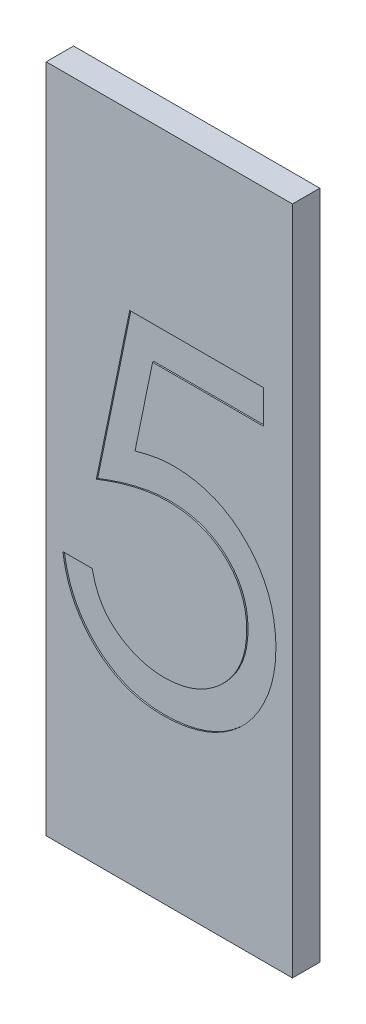
ISO-10303-21;
HEADER;
FILE_DESCRIPTION(('STEP AP214'),'2;1');
FILE_NAME('part.step','',(''),(''),'','','');
FILE_SCHEMA(('AUTOMOTIVE_DESIGN { 1 0 10303 214 1 1 1 1 }'));
ENDSEC;
DATA;
#1=APPLICATION_CONTEXT('core data for automotive mechanical design processes');
#2=APPLICATION_PROTOCOL_DEFINITION('international standard','automotive_design',2000,#1);
#3=PRODUCT_CONTEXT('',#1,'mechanical');
#4=PRODUCT('Part','Part','',(#3));
#5=PRODUCT_RELATED_PRODUCT_CATEGORY('part','',(#4));
#6=PRODUCT_DEFINITION_FORMATION('','',#4);
#7=PRODUCT_DEFINITION_CONTEXT('part definition',#1,'design');
#8=PRODUCT_DEFINITION('design','',#6,#7);
#9=PRODUCT_DEFINITION_SHAPE('','',#8);
#10=(LENGTH_UNIT() NAMED_UNIT(*) SI_UNIT(.MILLI.,.METRE.));
#11=(NAMED_UNIT(*) PLANE_ANGLE_UNIT() SI_UNIT($,.RADIAN.));
#12=(NAMED_UNIT(*) SI_UNIT($,.STERADIAN.) SOLID_ANGLE_UNIT());
#13=UNCERTAINTY_MEASURE_WITH_UNIT(LENGTH_MEASURE(1.E-05),#10,'distance_accuracy_value','');
#14=(GEOMETRIC_REPRESENTATION_CONTEXT(3) GLOBAL_UNCERTAINTY_ASSIGNED_CONTEXT((#13)) GLOBAL_UNIT_ASSIGNED_CONTEXT((#10,
#11,#12)) REPRESENTATION_CONTEXT('',''));
#15=CARTESIAN_POINT('',(0.,0.,0.));
#16=DIRECTION('',(0.,0.,1.));
#17=DIRECTION('',(1.,0.,0.));
#18=AXIS2_PLACEMENT_3D('',#15,#16,#17);
#19=CARTESIAN_POINT('',(0.,0.,2.));
#20=DIRECTION('',(0.,0.,1.));
#21=DIRECTION('',(1.,0.,0.));
#22=AXIS2_PLACEMENT_3D('',#19,#20,#21);
#23=PLANE('',#22);
#24=DIRECTION('',(0.,-1.,0.));
#25=VECTOR('',#24,1.);
#26=CARTESIAN_POINT('',(0.,0.,2.));
#27=LINE('',#26,#25);
#28=CARTESIAN_POINT('',(0.,49.,2.));
#29=VERTEX_POINT('',#28);
#30=CARTESIAN_POINT('',(0.,0.,2.));
#31=VERTEX_POINT('',#30);
#32=EDGE_CURVE('E198',#29,#31,#27,.T.);
#33=ORIENTED_EDGE('',*,*,#32,.T.);
#34=DIRECTION('',(1.,0.,0.));
#35=VECTOR('',#34,1.);
#36=CARTESIAN_POINT('',(18.,0.,2.));
#37=LINE('',#36,#35);
#38=CARTESIAN_POINT('',(18.,0.,2.));
#39=VERTEX_POINT('',#38);
#40=EDGE_CURVE('E85',#31,#39,#37,.T.);
#41=ORIENTED_EDGE('',*,*,#40,.T.);
#42=DIRECTION('',(0.,1.,0.));
#43=VECTOR('',#42,1.);
#44=CARTESIAN_POINT('',(18.,0.,2.));
#45=LINE('',#44,#43);
#46=CARTESIAN_POINT('',(18.,49.,2.));
#47=VERTEX_POINT('',#46);
#48=EDGE_CURVE('E201',#39,#47,#45,.T.);
#49=ORIENTED_EDGE('',*,*,#48,.T.);
#50=DIRECTION('',(-1.,0.,0.));
#51=VECTOR('',#50,1.);
#52=CARTESIAN_POINT('',(18.,49.,2.));
#53=LINE('',#52,#51);
#54=EDGE_CURVE('E57',#47,#29,#53,.T.);
#55=ORIENTED_EDGE('',*,*,#54,.T.);
#56=EDGE_LOOP('',(#33,#41,#49,#55));
#57=FACE_BOUND('',#56,.T.);
#58=DIRECTION('',(0.200944143721331,0.97960270064149,0.));
#59=VECTOR('',#58,1.);
#60=CARTESIAN_POINT('',(3.66346153846154,24.40625,2.));
#61=LINE('',#60,#59);
#62=CARTESIAN_POINT('',(3.66346153846154,24.40625,2.));
#63=VERTEX_POINT('',#62);
#64=CARTESIAN_POINT('',(6.10576923076923,36.3125,2.));
#65=VERTEX_POINT('',#64);
#66=EDGE_CURVE('E183',#63,#65,#61,.T.);
#67=ORIENTED_EDGE('',*,*,#66,.T.);
#68=DIRECTION('',(1.,0.,0.));
#69=VECTOR('',#68,1.);
#70=CARTESIAN_POINT('',(6.10576923076923,36.3125,2.));
#71=LINE('',#70,#69);
#72=CARTESIAN_POINT('',(15.875,36.3125,2.));
#73=VERTEX_POINT('',#72);
#74=EDGE_CURVE('E48',#65,#73,#71,.T.);
#75=ORIENTED_EDGE('',*,*,#74,.T.);
#76=DIRECTION('',(0.,-1.,0.));
#77=VECTOR('',#76,1.);
#78=CARTESIAN_POINT('',(15.875,36.3125,2.));
#79=LINE('',#78,#77);
#80=CARTESIAN_POINT('',(15.875,33.8701923076923,2.));
#81=VERTEX_POINT('',#80);
#82=EDGE_CURVE('E187',#73,#81,#79,.T.);
#83=ORIENTED_EDGE('',*,*,#82,.T.);
#84=DIRECTION('',(-1.,0.,0.));
#85=VECTOR('',#84,1.);
#86=CARTESIAN_POINT('',(15.875,33.8701923076923,2.));
#87=LINE('',#86,#85);
#88=CARTESIAN_POINT('',(7.77531550480769,33.8701923076923,2.));
#89=VERTEX_POINT('',#88);
#90=EDGE_CURVE('E505',#81,#89,#87,.T.);
#91=ORIENTED_EDGE('',*,*,#90,.T.);
#92=DIRECTION('',(-0.200705474463135,-0.979651628141621,0.));
#93=VECTOR('',#92,1.);
#94=CARTESIAN_POINT('',(7.77531550480769,33.8701923076923,2.));
#95=LINE('',#94,#93);
#96=CARTESIAN_POINT('',(6.49214993990385,27.6070087139423,2.));
#97=VERTEX_POINT('',#96);
#98=EDGE_CURVE('E502',#89,#97,#95,.T.);
#99=ORIENTED_EDGE('',*,*,#98,.T.);
#100=CARTESIAN_POINT('',(6.49214993990385,27.6070087139423,2.));
#101=CARTESIAN_POINT('',(6.74426222805327,27.6766110989371,2.));
#102=CARTESIAN_POINT('',(7.23268991219854,27.8114547115334,2.));
#103=CARTESIAN_POINT('',(7.95359539482673,27.9611725424912,2.));
#104=CARTESIAN_POINT('',(8.637981636299,28.051424938668,2.));
#105=CARTESIAN_POINT('',(9.08208728141334,28.063748319117,2.));
#106=CARTESIAN_POINT('',(9.29698768028846,28.0697115384615,2.));
#107=B_SPLINE_CURVE_WITH_KNOTS('',3,(#100,#101,#102,#103,#104,#105,#106),.UNSPECIFIED.,.F.,.F.,
(4,1,1,1,4),(0.,0.275068369018743,0.532901460089936,0.773973459592445,1.),.UNSPECIFIED.);
#108=CARTESIAN_POINT('',(9.29698768028846,28.0697115384615,2.));
#109=VERTEX_POINT('',#108);
#110=EDGE_CURVE('E495',#97,#109,#107,.T.);
#111=ORIENTED_EDGE('',*,*,#110,.T.);
#112=CARTESIAN_POINT('',(9.29698768028846,28.0697115384615,2.));
#113=CARTESIAN_POINT('',(9.56289669511612,28.0639561545391,2.));
#114=CARTESIAN_POINT('',(10.0857402554889,28.052639631768,2.));
#115=CARTESIAN_POINT('',(10.8507266627134,27.9439740132273,2.));
#116=CARTESIAN_POINT('',(11.5809736683581,27.7729328083322,2.));
#117=CARTESIAN_POINT('',(12.2749540797365,27.5339878300879,2.));
#118=CARTESIAN_POINT('',(12.9339517546079,27.2284412524621,2.));
#119=CARTESIAN_POINT('',(13.5519035568236,26.8467613010992,2.));
#120=CARTESIAN_POINT('',(14.1380850719662,26.4009006016703,2.));
#121=CARTESIAN_POINT('',(14.6819802201187,25.8882854310165,2.));
#122=CARTESIAN_POINT('',(15.1754045310298,25.3241222884705,2.));
#123=CARTESIAN_POINT('',(15.6092409964427,24.7175303444068,2.));
#124=CARTESIAN_POINT('',(15.9777400483343,24.0744046430983,2.));
#125=CARTESIAN_POINT('',(16.2741087556185,23.3886005015044,2.));
#126=CARTESIAN_POINT('',(16.5107664584602,22.667699832766,2.));
#127=CARTESIAN_POINT('',(16.668282709094,21.9041174407587,2.));
#128=CARTESIAN_POINT('',(16.7731713897056,21.1050507670963,2.));
#129=CARTESIAN_POINT('',(16.7848897680585,20.5586928885355,2.));
#130=CARTESIAN_POINT('',(16.7908653846154,20.2800856370192,2.));
#131=B_SPLINE_CURVE_WITH_KNOTS('',3,(#112,#113,#114,#115,#116,#117,#118,#119,#120,#121,#122,
#123,#124,#125,#126,#127,#128,#129,#130),.UNSPECIFIED.,.F.,.F.,(4,1,1,1,1,1,1,1,1,1,1,1,1,1,1,1,
4),(0.,0.0658076458106948,0.129394273668056,0.19089406063219,0.251281068929836,
0.310814964465273,0.370370987448245,0.430768262589727,0.492881250617502,0.55510394815525,
0.616067050993843,0.677256033174654,0.738259805199117,0.800762134376296,0.864777581574485,
0.931045294999404,1.),.UNSPECIFIED.);
#132=CARTESIAN_POINT('',(16.7908653846154,20.2800856370192,2.));
#133=VERTEX_POINT('',#132);
#134=EDGE_CURVE('E486',#109,#133,#131,.T.);
#135=ORIENTED_EDGE('',*,*,#134,.T.);
#136=CARTESIAN_POINT('',(16.7908653846154,20.2800856370192,2.));
#137=CARTESIAN_POINT('',(16.7863404974876,20.0860326735532,2.));
#138=CARTESIAN_POINT('',(16.7773518731663,19.7005492045104,2.));
#139=CARTESIAN_POINT('',(16.7316414822055,19.1280681248479,2.));
#140=CARTESIAN_POINT('',(16.6436324139831,18.5677067069127,2.));
#141=CARTESIAN_POINT('',(16.5254698624895,18.0193906124387,2.));
#142=CARTESIAN_POINT('',(16.3721009116885,17.4841579195771,2.));
#143=CARTESIAN_POINT('',(16.1864378842459,16.9604766313611,2.));
#144=CARTESIAN_POINT('',(15.959225625652,16.4516061819121,2.));
#145=CARTESIAN_POINT('',(15.7100014475511,15.9527316193396,2.));
#146=CARTESIAN_POINT('',(15.4293780880608,15.4751310614612,2.));
#147=CARTESIAN_POINT('',(15.1179207434868,15.0284834923047,2.));
#148=CARTESIAN_POINT('',(14.7888626692778,14.6060886486644,2.));
#149=CARTESIAN_POINT('',(14.4347953860706,14.2124766437269,2.));
#150=CARTESIAN_POINT('',(14.0524279014652,13.8502339684192,2.));
#151=CARTESIAN_POINT('',(13.6463909840668,13.5172108388878,2.));
#152=CARTESIAN_POINT('',(13.2199246278151,13.2077753595042,2.));
#153=CARTESIAN_POINT('',(12.7664309255957,12.9344881744709,2.));
#154=CARTESIAN_POINT('',(12.2960151040043,12.6830080620742,2.));
#155=CARTESIAN_POINT('',(11.8018838409592,12.4766997098462,2.));
#156=CARTESIAN_POINT('',(11.2952851467751,12.292251295554,2.));
#157=CARTESIAN_POINT('',(10.7689276896032,12.1452293309108,2.));
#158=CARTESIAN_POINT('',(10.2240037144852,12.0300274867704,2.));
#159=CARTESIAN_POINT('',(9.65961497415169,11.9517823291,2.));
#160=CARTESIAN_POINT('',(9.07872148702582,11.8947926384543,2.));
#161=CARTESIAN_POINT('',(8.68496470500919,11.8912251384866,2.));
#162=CARTESIAN_POINT('',(8.48606520432692,11.8894230769231,2.));
#163=B_SPLINE_CURVE_WITH_KNOTS('',3,(#136,#137,#138,#139,#140,#141,#142,#143,#144,#145,#146,
#147,#148,#149,#150,#151,#152,#153,#154,#155,#156,#157,#158,#159,#160,#161,#162),.UNSPECIFIED.,
.F.,.F.,(4,1,1,1,1,1,1,1,1,1,1,1,1,1,1,1,1,1,1,1,1,1,1,1,4),(0.,0.0440144705761401,
0.0874341236677057,0.130118398657898,0.172553694558182,0.214554755968139,0.256298092097131,
0.29843822513325,0.340849002588096,0.382715188967027,0.423924045407532,0.464246243250417,
0.504073671461796,0.543861905868491,0.583566724979654,0.623094318852334,0.663229060768585,
0.70355125861147,0.743937894686184,0.784541254800092,0.825750111240597,0.867757363388507,
0.91074516403231,0.954914446891478,1.),.UNSPECIFIED.);
#164=CARTESIAN_POINT('',(8.48606520432692,11.8894230769231,2.));
#165=VERTEX_POINT('',#164);
#166=EDGE_CURVE('E494',#133,#165,#163,.T.);
#167=ORIENTED_EDGE('',*,*,#166,.T.);
#168=CARTESIAN_POINT('',(8.48606520432692,11.8894230769231,2.));
#169=CARTESIAN_POINT('',(8.24879622490653,11.8941232424939,2.));
#170=CARTESIAN_POINT('',(7.78199753743902,11.9033702630049,2.));
#171=CARTESIAN_POINT('',(7.09809867932712,12.0001067430371,2.));
#172=CARTESIAN_POINT('',(6.44009395130554,12.1386541027792,2.));
#173=CARTESIAN_POINT('',(5.81328022735951,12.3470901529975,2.));
#174=CARTESIAN_POINT('',(5.2120400225078,12.608260854372,2.));
#175=CARTESIAN_POINT('',(4.64446760326579,12.938344092582,2.));
#176=CARTESIAN_POINT('',(4.09606044836867,13.3123983520038,2.));
#177=CARTESIAN_POINT('',(3.58911248405509,13.7538164677107,2.));
#178=CARTESIAN_POINT('',(3.11860392634194,14.2362963758247,2.));
#179=CARTESIAN_POINT('',(2.69741857134916,14.7598831844702,2.));
#180=CARTESIAN_POINT('',(2.32231334390867,15.3159352815203,2.));
#181=CARTESIAN_POINT('',(1.99929510100243,15.9071530797855,2.));
#182=CARTESIAN_POINT('',(1.72376392026054,16.5319830849147,2.));
#183=CARTESIAN_POINT('',(1.5073083750208,17.1927663588403,2.));
#184=CARTESIAN_POINT('',(1.33260385299708,17.8860503142137,2.));
#185=CARTESIAN_POINT('',(1.25869379582758,18.3633447332568,2.));
#186=CARTESIAN_POINT('',(1.22115384615385,18.6057692307692,2.));
#187=B_SPLINE_CURVE_WITH_KNOTS('',3,(#168,#169,#170,#171,#172,#173,#174,#175,#176,#177,#178,
#179,#180,#181,#182,#183,#184,#185,#186),.UNSPECIFIED.,.F.,.F.,(4,1,1,1,1,1,1,1,1,1,1,1,1,1,1,1,
4),(0.,0.0654211437588924,0.128708371881883,0.190236141863538,0.250724402033539,
0.310637179413444,0.370766408289727,0.431614744412353,0.493522973566354,0.555883455377533,
0.61734236731851,0.678668039097275,0.740711359545148,0.802985362512745,0.866802580265517,
0.932347171345888,1.),.UNSPECIFIED.);
#188=CARTESIAN_POINT('',(1.22115384615385,18.6057692307692,2.));
#189=VERTEX_POINT('',#188);
#190=EDGE_CURVE('E522',#165,#189,#187,.T.);
#191=ORIENTED_EDGE('',*,*,#190,.T.);
#192=DIRECTION('',(1.,0.,0.));
#193=VECTOR('',#192,1.);
#194=CARTESIAN_POINT('',(1.22115384615385,18.6057692307692,2.));
#195=LINE('',#194,#193);
#196=CARTESIAN_POINT('',(3.35817307692308,18.6057692307692,2.));
#197=VERTEX_POINT('',#196);
#198=EDGE_CURVE('E530',#189,#197,#195,.T.);
#199=ORIENTED_EDGE('',*,*,#198,.T.);
#200=CARTESIAN_POINT('',(3.35817307692308,18.6057692307692,2.));
#201=CARTESIAN_POINT('',(3.41075486916687,18.3786901525025,2.));
#202=CARTESIAN_POINT('',(3.51181999352353,17.9422315552486,2.));
#203=CARTESIAN_POINT('',(3.73365553413968,17.3290165365361,2.));
#204=CARTESIAN_POINT('',(4.00488586548086,16.782558961169,2.));
#205=CARTESIAN_POINT('',(4.32740473596267,16.2956301892543,2.));
#206=CARTESIAN_POINT('',(4.71214690766356,15.8710261185266,2.));
#207=CARTESIAN_POINT('',(5.1511774867062,15.4926314649857,2.));
#208=CARTESIAN_POINT('',(5.64340038918666,15.1512613886681,2.));
#209=CARTESIAN_POINT('',(6.19036146859881,14.8667172047006,2.));
#210=CARTESIAN_POINT('',(6.76739331183204,14.6240422931755,2.));
#211=CARTESIAN_POINT('',(7.37132736564727,14.4624459400221,2.));
#212=CARTESIAN_POINT('',(7.9857194371738,14.3488202226452,2.));
#213=CARTESIAN_POINT('',(8.40127049154639,14.3374462786196,2.));
#214=CARTESIAN_POINT('',(8.61008864182692,14.3317307692308,2.));
#215=B_SPLINE_CURVE_WITH_KNOTS('',3,(#200,#201,#202,#203,#204,#205,#206,#207,#208,#209,#210,
#211,#212,#213,#214),.UNSPECIFIED.,.F.,.F.,(4,1,1,1,1,1,1,1,1,1,1,1,4),(0.,0.0946872518675539,
0.181994155707274,0.264376948610512,0.342179861947772,0.418617610862147,0.496509075371909,
0.577369091611732,0.661510592454198,0.746732550829197,0.831257984327743,0.915205616213655,1.),.UNSPECIFIED.);
#216=CARTESIAN_POINT('',(8.61008864182692,14.3317307692308,2.));
#217=VERTEX_POINT('',#216);
#218=EDGE_CURVE('E536',#197,#217,#215,.T.);
#219=ORIENTED_EDGE('',*,*,#218,.T.);
#220=CARTESIAN_POINT('',(8.61008864182692,14.3317307692308,2.));
#221=CARTESIAN_POINT('',(8.81391305830883,14.3373149903351,2.));
#222=CARTESIAN_POINT('',(9.21524500212752,14.3483103673818,2.));
#223=CARTESIAN_POINT('',(9.80587247230671,14.432940074636,2.));
#224=CARTESIAN_POINT('',(10.3760993485748,14.5632799794253,2.));
#225=CARTESIAN_POINT('',(10.9202990436671,14.7583373856541,2.));
#226=CARTESIAN_POINT('',(11.4479945183711,14.9954059163726,2.));
#227=CARTESIAN_POINT('',(11.9458374921425,15.2996281286199,2.));
#228=CARTESIAN_POINT('',(12.4282302812603,15.6497400398261,2.));
#229=CARTESIAN_POINT('',(12.8801788325375,16.0508556835142,2.));
#230=CARTESIAN_POINT('',(13.2941043712498,16.4928816415487,2.));
#231=CARTESIAN_POINT('',(13.6598379811073,16.9655760503861,2.));
#232=CARTESIAN_POINT('',(13.9644809099531,17.469835309901,2.));
#233=CARTESIAN_POINT('',(14.2212076149415,17.9969294391189,2.));
#234=CARTESIAN_POINT('',(14.4161523801455,18.5526353370651,2.));
#235=CARTESIAN_POINT('',(14.5552240559649,19.1343486895774,2.));
#236=CARTESIAN_POINT('',(14.6368877239979,19.7435063227676,2.));
#237=CARTESIAN_POINT('',(14.6481216448786,20.1589957339237,2.));
#238=CARTESIAN_POINT('',(14.6538461538462,20.3707181490385,2.));
#239=B_SPLINE_CURVE_WITH_KNOTS('',3,(#220,#221,#222,#223,#224,#225,#226,#227,#228,#229,#230,
#231,#232,#233,#234,#235,#236,#237,#238),.UNSPECIFIED.,.F.,.F.,(4,1,1,1,1,1,1,1,1,1,1,1,1,1,1,1,
4),(0.,0.0642072952829857,0.126424689779743,0.187680284264922,0.248216424455213,
0.308305060008613,0.369660991325143,0.43169855178678,0.495946892208764,0.559758023972119,
0.622295407826158,0.683910635284174,0.745092408056624,0.806740225389293,0.869086618121202,
0.933290002974799,1.),.UNSPECIFIED.);
#240=CARTESIAN_POINT('',(14.6538461538462,20.3707181490385,2.));
#241=VERTEX_POINT('',#240);
#242=EDGE_CURVE('E541',#217,#241,#239,.T.);
#243=ORIENTED_EDGE('',*,*,#242,.T.);
#244=CARTESIAN_POINT('',(14.6538461538462,20.3707181490385,2.));
#245=CARTESIAN_POINT('',(14.6493661417959,20.5617335306041,2.));
#246=CARTESIAN_POINT('',(14.6405971556437,20.9356189614974,2.));
#247=CARTESIAN_POINT('',(14.568951668404,21.4826207053209,2.));
#248=CARTESIAN_POINT('',(14.4443308386404,22.0001890824085,2.));
#249=CARTESIAN_POINT('',(14.2713576554298,22.4908234242535,2.));
#250=CARTESIAN_POINT('',(14.0517417188851,22.9549864873714,2.));
#251=CARTESIAN_POINT('',(13.7833659154303,23.393157307662,2.));
#252=CARTESIAN_POINT('',(13.4611936901361,23.7995607087003,2.));
#253=CARTESIAN_POINT('',(13.0931756624168,24.174386832365,2.));
#254=CARTESIAN_POINT('',(12.6900093481433,24.520313570341,2.));
#255=CARTESIAN_POINT('',(12.2447581708307,24.815208158523,2.));
#256=CARTESIAN_POINT('',(11.7667397403137,25.0632930268327,2.));
#257=CARTESIAN_POINT('',(11.2617133582131,25.2773878012719,2.));
#258=CARTESIAN_POINT('',(10.7176664588952,25.4311535869353,2.));
#259=CARTESIAN_POINT('',(10.1453729421711,25.5465958075324,2.));
#260=CARTESIAN_POINT('',(9.53865283988917,25.6133753286113,2.));
#261=CARTESIAN_POINT('',(9.12383440812065,25.6226410334535,2.));
#262=CARTESIAN_POINT('',(8.91060697115385,25.6274038461538,2.));
#263=B_SPLINE_CURVE_WITH_KNOTS('',3,(#244,#245,#246,#247,#248,#249,#250,#251,#252,#253,#254,
#255,#256,#257,#258,#259,#260,#261,#262),.UNSPECIFIED.,.F.,.F.,(4,1,1,1,1,1,1,1,1,1,1,1,1,1,1,1,
4),(0.,0.0653513820265931,0.127916031830612,0.1883602055717,0.247216077265452,0.305630129197411,
0.363769839831819,0.42266091391278,0.482687294090392,0.543300221239559,0.604117955323103,
0.664964891265284,0.727413494112565,0.791467625149424,0.8580554427291,0.927036814614948,1.),.UNSPECIFIED.);
#264=CARTESIAN_POINT('',(8.91060697115385,25.6274038461538,2.));
#265=VERTEX_POINT('',#264);
#266=EDGE_CURVE('E549',#241,#265,#263,.T.);
#267=ORIENTED_EDGE('',*,*,#266,.T.);
#268=CARTESIAN_POINT('',(8.91060697115385,25.6274038461538,2.));
#269=CARTESIAN_POINT('',(8.72603336623871,25.6234537527424,2.));
#270=CARTESIAN_POINT('',(8.34493569876172,25.615297811994,2.));
#271=CARTESIAN_POINT('',(7.7603536097644,25.5552461103721,2.));
#272=CARTESIAN_POINT('',(7.14604742308346,25.4583680536378,2.));
#273=CARTESIAN_POINT('',(6.50437201581717,25.3251116199635,2.));
#274=CARTESIAN_POINT('',(5.83340034461635,25.150728758445,2.));
#275=CARTESIAN_POINT('',(5.13454836823971,24.9417604595461,2.));
#276=CARTESIAN_POINT('',(4.40634669726955,24.6919197182982,2.));
#277=CARTESIAN_POINT('',(3.91568860805667,24.5032416212003,2.));
#278=CARTESIAN_POINT('',(3.66346153846154,24.40625,2.));
#279=B_SPLINE_CURVE_WITH_KNOTS('',3,(#268,#269,#270,#271,#272,#273,#274,#275,#276,#277,#278),
.UNSPECIFIED.,.F.,.F.,(4,1,1,1,1,1,1,1,4),(0.,0.10220303703522,0.211023342373876,
0.325099661565208,0.446502097134889,0.573787717648856,0.708900709766066,0.850357871293401,1.),.UNSPECIFIED.);
#280=EDGE_CURVE('E557',#265,#63,#279,.T.);
#281=ORIENTED_EDGE('',*,*,#280,.T.);
#282=EDGE_LOOP('',(#67,#75,#83,#91,#99,#111,#135,#167,#191,#199,#219,#243,#267,#281));
#283=FACE_BOUND('',#282,.T.);
#284=ADVANCED_FACE('F33',(#57,#283),#23,.T.);
#285=CARTESIAN_POINT('',(0.,0.,2.));
#286=DIRECTION('',(1.,0.,0.));
#287=DIRECTION('',(0.,0.,-1.));
#288=AXIS2_PLACEMENT_3D('',#285,#286,#287);
#289=PLANE('',#288);
#290=DIRECTION('',(0.,-1.,0.));
#291=VECTOR('',#290,1.);
#292=CARTESIAN_POINT('',(0.,0.,0.));
#293=LINE('',#292,#291);
#294=CARTESIAN_POINT('',(0.,49.,0.));
#295=VERTEX_POINT('',#294);
#296=CARTESIAN_POINT('',(0.,0.,0.));
#297=VERTEX_POINT('',#296);
#298=EDGE_CURVE('E188',#295,#297,#293,.T.);
#299=ORIENTED_EDGE('',*,*,#298,.T.);
#300=DIRECTION('',(0.,0.,-1.));
#301=VECTOR('',#300,1.);
#302=CARTESIAN_POINT('',(0.,0.,2.));
#303=LINE('',#302,#301);
#304=EDGE_CURVE('E11',#31,#297,#303,.T.);
#305=ORIENTED_EDGE('',*,*,#304,.F.);
#306=ORIENTED_EDGE('',*,*,#32,.F.);
#307=DIRECTION('',(0.,0.,-1.));
#308=VECTOR('',#307,1.);
#309=CARTESIAN_POINT('',(0.,49.,2.));
#310=LINE('',#309,#308);
#311=EDGE_CURVE('E203',#29,#295,#310,.T.);
#312=ORIENTED_EDGE('',*,*,#311,.T.);
#313=EDGE_LOOP('',(#299,#305,#306,#312));
#314=FACE_BOUND('',#313,.T.);
#315=ADVANCED_FACE('F35',(#314),#289,.F.);
#316=CARTESIAN_POINT('',(18.,0.,2.));
#317=DIRECTION('',(0.,1.,0.));
#318=DIRECTION('',(0.,0.,1.));
#319=AXIS2_PLACEMENT_3D('',#316,#317,#318);
#320=PLANE('',#319);
#321=DIRECTION('',(1.,0.,0.));
#322=VECTOR('',#321,1.);
#323=CARTESIAN_POINT('',(18.,0.,0.));
#324=LINE('',#323,#322);
#325=CARTESIAN_POINT('',(18.,0.,0.));
#326=VERTEX_POINT('',#325);
#327=EDGE_CURVE('E192',#297,#326,#324,.T.);
#328=ORIENTED_EDGE('',*,*,#327,.T.);
#329=DIRECTION('',(0.,0.,-1.));
#330=VECTOR('',#329,1.);
#331=CARTESIAN_POINT('',(18.,0.,2.));
#332=LINE('',#331,#330);
#333=EDGE_CURVE('E41',#39,#326,#332,.T.);
#334=ORIENTED_EDGE('',*,*,#333,.F.);
#335=ORIENTED_EDGE('',*,*,#40,.F.);
#336=ORIENTED_EDGE('',*,*,#304,.T.);
#337=EDGE_LOOP('',(#328,#334,#335,#336));
#338=FACE_BOUND('',#337,.T.);
#339=ADVANCED_FACE('F231',(#338),#320,.F.);
#340=CARTESIAN_POINT('',(18.,0.,2.));
#341=DIRECTION('',(-1.,0.,0.));
#342=DIRECTION('',(0.,0.,1.));
#343=AXIS2_PLACEMENT_3D('',#340,#341,#342);
#344=PLANE('',#343);
#345=DIRECTION('',(0.,1.,0.));
#346=VECTOR('',#345,1.);
#347=CARTESIAN_POINT('',(18.,0.,0.));
#348=LINE('',#347,#346);
#349=CARTESIAN_POINT('',(18.,49.,0.));
#350=VERTEX_POINT('',#349);
#351=EDGE_CURVE('E206',#326,#350,#348,.T.);
#352=ORIENTED_EDGE('',*,*,#351,.T.);
#353=DIRECTION('',(0.,0.,-1.));
#354=VECTOR('',#353,1.);
#355=CARTESIAN_POINT('',(18.,49.,2.));
#356=LINE('',#355,#354);
#357=EDGE_CURVE('E210',#47,#350,#356,.T.);
#358=ORIENTED_EDGE('',*,*,#357,.F.);
#359=ORIENTED_EDGE('',*,*,#48,.F.);
#360=ORIENTED_EDGE('',*,*,#333,.T.);
#361=EDGE_LOOP('',(#352,#358,#359,#360));
#362=FACE_BOUND('',#361,.T.);
#363=ADVANCED_FACE('F215',(#362),#344,.F.);
#364=CARTESIAN_POINT('',(18.,49.,2.));
#365=DIRECTION('',(0.,-1.,0.));
#366=DIRECTION('',(0.,0.,-1.));
#367=AXIS2_PLACEMENT_3D('',#364,#365,#366);
#368=PLANE('',#367);
#369=DIRECTION('',(-1.,0.,0.));
#370=VECTOR('',#369,1.);
#371=CARTESIAN_POINT('',(18.,49.,0.));
#372=LINE('',#371,#370);
#373=EDGE_CURVE('E78',#350,#295,#372,.T.);
#374=ORIENTED_EDGE('',*,*,#373,.T.);
#375=ORIENTED_EDGE('',*,*,#311,.F.);
#376=ORIENTED_EDGE('',*,*,#54,.F.);
#377=ORIENTED_EDGE('',*,*,#357,.T.);
#378=EDGE_LOOP('',(#374,#375,#376,#377));
#379=FACE_BOUND('',#378,.T.);
#380=ADVANCED_FACE('F223',(#379),#368,.F.);
#381=CARTESIAN_POINT('',(0.,0.,0.));
#382=DIRECTION('',(0.,0.,1.));
#383=DIRECTION('',(1.,0.,0.));
#384=AXIS2_PLACEMENT_3D('',#381,#382,#383);
#385=PLANE('',#384);
#386=ORIENTED_EDGE('',*,*,#298,.F.);
#387=ORIENTED_EDGE('',*,*,#373,.F.);
#388=ORIENTED_EDGE('',*,*,#351,.F.);
#389=ORIENTED_EDGE('',*,*,#327,.F.);
#390=EDGE_LOOP('',(#386,#387,#388,#389));
#391=FACE_BOUND('',#390,.T.);
#392=ADVANCED_FACE('F219',(#391),#385,.F.);
#393=CARTESIAN_POINT('',(6.10576923076923,36.3125,1.9));
#394=DIRECTION('',(0.,-1.,0.));
#395=DIRECTION('',(0.,0.,-1.));
#396=AXIS2_PLACEMENT_3D('',#393,#394,#395);
#397=PLANE('',#396);
#398=ORIENTED_EDGE('',*,*,#74,.F.);
#399=DIRECTION('',(0.,0.,1.));
#400=VECTOR('',#399,1.);
#401=CARTESIAN_POINT('',(6.10576923076923,36.3125,1.9));
#402=LINE('',#401,#400);
#403=CARTESIAN_POINT('',(6.10576923076923,36.3125,1.9));
#404=VERTEX_POINT('',#403);
#405=EDGE_CURVE('E182',#404,#65,#402,.T.);
#406=ORIENTED_EDGE('',*,*,#405,.F.);
#407=DIRECTION('',(1.,0.,0.));
#408=VECTOR('',#407,1.);
#409=CARTESIAN_POINT('',(6.10576923076923,36.3125,1.9));
#410=LINE('',#409,#408);
#411=CARTESIAN_POINT('',(15.875,36.3125,1.9));
#412=VERTEX_POINT('',#411);
#413=EDGE_CURVE('E173',#404,#412,#410,.T.);
#414=ORIENTED_EDGE('',*,*,#413,.T.);
#415=DIRECTION('',(0.,0.,1.));
#416=VECTOR('',#415,1.);
#417=CARTESIAN_POINT('',(15.875,36.3125,1.9));
#418=LINE('',#417,#416);
#419=EDGE_CURVE('E181',#412,#73,#418,.T.);
#420=ORIENTED_EDGE('',*,*,#419,.T.);
#421=EDGE_LOOP('',(#398,#406,#414,#420));
#422=FACE_BOUND('',#421,.T.);
#423=ADVANCED_FACE('F180',(#422),#397,.T.);
#424=CARTESIAN_POINT('',(15.875,36.3125,1.9));
#425=DIRECTION('',(-1.,0.,0.));
#426=DIRECTION('',(0.,0.,1.));
#427=AXIS2_PLACEMENT_3D('',#424,#425,#426);
#428=PLANE('',#427);
#429=ORIENTED_EDGE('',*,*,#82,.F.);
#430=ORIENTED_EDGE('',*,*,#419,.F.);
#431=DIRECTION('',(0.,-1.,0.));
#432=VECTOR('',#431,1.);
#433=CARTESIAN_POINT('',(15.875,36.3125,1.9));
#434=LINE('',#433,#432);
#435=CARTESIAN_POINT('',(15.875,33.8701923076923,1.9));
#436=VERTEX_POINT('',#435);
#437=EDGE_CURVE('E169',#412,#436,#434,.T.);
#438=ORIENTED_EDGE('',*,*,#437,.T.);
#439=DIRECTION('',(0.,0.,1.));
#440=VECTOR('',#439,1.);
#441=CARTESIAN_POINT('',(15.875,33.8701923076923,1.9));
#442=LINE('',#441,#440);
#443=EDGE_CURVE('E189',#436,#81,#442,.T.);
#444=ORIENTED_EDGE('',*,*,#443,.T.);
#445=EDGE_LOOP('',(#429,#430,#438,#444));
#446=FACE_BOUND('',#445,.T.);
#447=ADVANCED_FACE('F185',(#446),#428,.T.);
#448=CARTESIAN_POINT('',(15.875,33.8701923076923,1.9));
#449=DIRECTION('',(0.,1.,0.));
#450=DIRECTION('',(0.,0.,1.));
#451=AXIS2_PLACEMENT_3D('',#448,#449,#450);
#452=PLANE('',#451);
#453=ORIENTED_EDGE('',*,*,#90,.F.);
#454=ORIENTED_EDGE('',*,*,#443,.F.);
#455=DIRECTION('',(-1.,0.,0.));
#456=VECTOR('',#455,1.);
#457=CARTESIAN_POINT('',(15.875,33.8701923076923,1.9));
#458=LINE('',#457,#456);
#459=CARTESIAN_POINT('',(7.77531550480769,33.8701923076923,1.9));
#460=VERTEX_POINT('',#459);
#461=EDGE_CURVE('E175',#436,#460,#458,.T.);
#462=ORIENTED_EDGE('',*,*,#461,.T.);
#463=DIRECTION('',(0.,0.,1.));
#464=VECTOR('',#463,1.);
#465=CARTESIAN_POINT('',(7.77531550480769,33.8701923076923,1.9));
#466=LINE('',#465,#464);
#467=EDGE_CURVE('E194',#460,#89,#466,.T.);
#468=ORIENTED_EDGE('',*,*,#467,.T.);
#469=EDGE_LOOP('',(#453,#454,#462,#468));
#470=FACE_BOUND('',#469,.T.);
#471=ADVANCED_FACE('F244',(#470),#452,.T.);
#472=CARTESIAN_POINT('',(7.77531550480769,33.8701923076923,1.9));
#473=DIRECTION('',(-0.979651628141621,0.200705474463135,0.));
#474=DIRECTION('',(-0.200705474463135,-0.979651628141621,0.));
#475=AXIS2_PLACEMENT_3D('',#472,#473,#474);
#476=PLANE('',#475);
#477=ORIENTED_EDGE('',*,*,#98,.F.);
#478=ORIENTED_EDGE('',*,*,#467,.F.);
#479=DIRECTION('',(-0.200705474463135,-0.979651628141621,0.));
#480=VECTOR('',#479,1.);
#481=CARTESIAN_POINT('',(7.77531550480769,33.8701923076923,1.9));
#482=LINE('',#481,#480);
#483=CARTESIAN_POINT('',(6.49214993990385,27.6070087139423,1.9));
#484=VERTEX_POINT('',#483);
#485=EDGE_CURVE('E266',#460,#484,#482,.T.);
#486=ORIENTED_EDGE('',*,*,#485,.T.);
#487=DIRECTION('',(0.,0.,1.));
#488=VECTOR('',#487,1.);
#489=CARTESIAN_POINT('',(6.49214993990385,27.6070087139423,1.9));
#490=LINE('',#489,#488);
#491=EDGE_CURVE('E587',#484,#97,#490,.T.);
#492=ORIENTED_EDGE('',*,*,#491,.T.);
#493=EDGE_LOOP('',(#477,#478,#486,#492));
#494=FACE_BOUND('',#493,.T.);
#495=ADVANCED_FACE('F247',(#494),#476,.T.);
#496=CARTESIAN_POINT('',(6.49214993990385,27.6070087139423,1.9));
#497=CARTESIAN_POINT('',(6.74426222805327,27.6766110989371,1.9));
#498=CARTESIAN_POINT('',(7.23268991219854,27.8114547115334,1.9));
#499=CARTESIAN_POINT('',(7.95359539482673,27.9611725424912,1.9));
#500=CARTESIAN_POINT('',(8.637981636299,28.051424938668,1.9));
#501=CARTESIAN_POINT('',(9.08208728141334,28.063748319117,1.9));
#502=CARTESIAN_POINT('',(9.29698768028846,28.0697115384615,1.9));
#503=B_SPLINE_CURVE_WITH_KNOTS('',3,(#496,#497,#498,#499,#500,#501,#502),.UNSPECIFIED.,.F.,.F.,
(4,1,1,1,4),(0.,0.275068369018743,0.532901460089936,0.773973459592445,1.),.UNSPECIFIED.);
#504=DIRECTION('',(0.,0.,1.));
#505=VECTOR('',#504,1.);
#506=SURFACE_OF_LINEAR_EXTRUSION('',#503,#505);
#507=ORIENTED_EDGE('',*,*,#110,.F.);
#508=ORIENTED_EDGE('',*,*,#491,.F.);
#509=CARTESIAN_POINT('',(9.29698768028846,28.0697115384615,1.9));
#510=VERTEX_POINT('',#509);
#511=EDGE_CURVE('E260',#484,#510,#503,.T.);
#512=ORIENTED_EDGE('',*,*,#511,.T.);
#513=DIRECTION('',(0.,0.,1.));
#514=VECTOR('',#513,1.);
#515=CARTESIAN_POINT('',(9.29698768028846,28.0697115384615,1.9));
#516=LINE('',#515,#514);
#517=EDGE_CURVE('E488',#510,#109,#516,.T.);
#518=ORIENTED_EDGE('',*,*,#517,.T.);
#519=EDGE_LOOP('',(#507,#508,#512,#518));
#520=FACE_BOUND('',#519,.T.);
#521=ADVANCED_FACE('F251',(#520),#506,.T.);
#522=CARTESIAN_POINT('',(9.29698768028846,28.0697115384615,1.9));
#523=CARTESIAN_POINT('',(9.56289669511612,28.0639561545391,1.9));
#524=CARTESIAN_POINT('',(10.0857402554889,28.052639631768,1.9));
#525=CARTESIAN_POINT('',(10.8507266627134,27.9439740132273,1.9));
#526=CARTESIAN_POINT('',(11.5809736683581,27.7729328083322,1.9));
#527=CARTESIAN_POINT('',(12.2749540797365,27.5339878300879,1.9));
#528=CARTESIAN_POINT('',(12.9339517546079,27.2284412524621,1.9));
#529=CARTESIAN_POINT('',(13.5519035568236,26.8467613010992,1.9));
#530=CARTESIAN_POINT('',(14.1380850719662,26.4009006016703,1.9));
#531=CARTESIAN_POINT('',(14.6819802201187,25.8882854310165,1.9));
#532=CARTESIAN_POINT('',(15.1754045310298,25.3241222884705,1.9));
#533=CARTESIAN_POINT('',(15.6092409964427,24.7175303444068,1.9));
#534=CARTESIAN_POINT('',(15.9777400483343,24.0744046430983,1.9));
#535=CARTESIAN_POINT('',(16.2741087556185,23.3886005015044,1.9));
#536=CARTESIAN_POINT('',(16.5107664584602,22.667699832766,1.9));
#537=CARTESIAN_POINT('',(16.668282709094,21.9041174407587,1.9));
#538=CARTESIAN_POINT('',(16.7731713897056,21.1050507670963,1.9));
#539=CARTESIAN_POINT('',(16.7848897680585,20.5586928885355,1.9));
#540=CARTESIAN_POINT('',(16.7908653846154,20.2800856370192,1.9));
#541=B_SPLINE_CURVE_WITH_KNOTS('',3,(#522,#523,#524,#525,#526,#527,#528,#529,#530,#531,#532,
#533,#534,#535,#536,#537,#538,#539,#540),.UNSPECIFIED.,.F.,.F.,(4,1,1,1,1,1,1,1,1,1,1,1,1,1,1,1,
4),(0.,0.0658076458106948,0.129394273668056,0.19089406063219,0.251281068929836,
0.310814964465273,0.370370987448245,0.430768262589727,0.492881250617502,0.55510394815525,
0.616067050993843,0.677256033174654,0.738259805199117,0.800762134376296,0.864777581574485,
0.931045294999404,1.),.UNSPECIFIED.);
#542=DIRECTION('',(0.,0.,1.));
#543=VECTOR('',#542,1.);
#544=SURFACE_OF_LINEAR_EXTRUSION('',#541,#543);
#545=ORIENTED_EDGE('',*,*,#134,.F.);
#546=ORIENTED_EDGE('',*,*,#517,.F.);
#547=CARTESIAN_POINT('',(16.7908653846154,20.2800856370192,1.9));
#548=VERTEX_POINT('',#547);
#549=EDGE_CURVE('E265',#510,#548,#541,.T.);
#550=ORIENTED_EDGE('',*,*,#549,.T.);
#551=DIRECTION('',(0.,0.,1.));
#552=VECTOR('',#551,1.);
#553=CARTESIAN_POINT('',(16.7908653846154,20.2800856370192,1.9));
#554=LINE('',#553,#552);
#555=EDGE_CURVE('E491',#548,#133,#554,.T.);
#556=ORIENTED_EDGE('',*,*,#555,.T.);
#557=EDGE_LOOP('',(#545,#546,#550,#556));
#558=FACE_BOUND('',#557,.T.);
#559=ADVANCED_FACE('F256',(#558),#544,.T.);
#560=CARTESIAN_POINT('',(16.7908653846154,20.2800856370192,1.9));
#561=CARTESIAN_POINT('',(16.7863404974876,20.0860326735532,1.9));
#562=CARTESIAN_POINT('',(16.7773518731663,19.7005492045104,1.9));
#563=CARTESIAN_POINT('',(16.7316414822055,19.1280681248479,1.9));
#564=CARTESIAN_POINT('',(16.6436324139831,18.5677067069127,1.9));
#565=CARTESIAN_POINT('',(16.5254698624895,18.0193906124387,1.9));
#566=CARTESIAN_POINT('',(16.3721009116885,17.4841579195771,1.9));
#567=CARTESIAN_POINT('',(16.1864378842459,16.9604766313611,1.9));
#568=CARTESIAN_POINT('',(15.959225625652,16.4516061819121,1.9));
#569=CARTESIAN_POINT('',(15.7100014475511,15.9527316193396,1.9));
#570=CARTESIAN_POINT('',(15.4293780880608,15.4751310614612,1.9));
#571=CARTESIAN_POINT('',(15.1179207434868,15.0284834923047,1.9));
#572=CARTESIAN_POINT('',(14.7888626692778,14.6060886486644,1.9));
#573=CARTESIAN_POINT('',(14.4347953860706,14.2124766437269,1.9));
#574=CARTESIAN_POINT('',(14.0524279014652,13.8502339684192,1.9));
#575=CARTESIAN_POINT('',(13.6463909840668,13.5172108388878,1.9));
#576=CARTESIAN_POINT('',(13.2199246278151,13.2077753595042,1.9));
#577=CARTESIAN_POINT('',(12.7664309255957,12.9344881744709,1.9));
#578=CARTESIAN_POINT('',(12.2960151040043,12.6830080620742,1.9));
#579=CARTESIAN_POINT('',(11.8018838409592,12.4766997098462,1.9));
#580=CARTESIAN_POINT('',(11.2952851467751,12.292251295554,1.9));
#581=CARTESIAN_POINT('',(10.7689276896032,12.1452293309108,1.9));
#582=CARTESIAN_POINT('',(10.2240037144852,12.0300274867704,1.9));
#583=CARTESIAN_POINT('',(9.65961497415169,11.9517823291,1.9));
#584=CARTESIAN_POINT('',(9.07872148702582,11.8947926384543,1.9));
#585=CARTESIAN_POINT('',(8.68496470500919,11.8912251384866,1.9));
#586=CARTESIAN_POINT('',(8.48606520432692,11.8894230769231,1.9));
#587=B_SPLINE_CURVE_WITH_KNOTS('',3,(#560,#561,#562,#563,#564,#565,#566,#567,#568,#569,#570,
#571,#572,#573,#574,#575,#576,#577,#578,#579,#580,#581,#582,#583,#584,#585,#586),.UNSPECIFIED.,
.F.,.F.,(4,1,1,1,1,1,1,1,1,1,1,1,1,1,1,1,1,1,1,1,1,1,1,1,4),(0.,0.0440144705761401,
0.0874341236677057,0.130118398657898,0.172553694558182,0.214554755968139,0.256298092097131,
0.29843822513325,0.340849002588096,0.382715188967027,0.423924045407532,0.464246243250417,
0.504073671461796,0.543861905868491,0.583566724979654,0.623094318852334,0.663229060768585,
0.70355125861147,0.743937894686184,0.784541254800092,0.825750111240597,0.867757363388507,
0.91074516403231,0.954914446891478,1.),.UNSPECIFIED.);
#588=DIRECTION('',(0.,0.,1.));
#589=VECTOR('',#588,1.);
#590=SURFACE_OF_LINEAR_EXTRUSION('',#587,#589);
#591=ORIENTED_EDGE('',*,*,#166,.F.);
#592=ORIENTED_EDGE('',*,*,#555,.F.);
#593=CARTESIAN_POINT('',(8.48606520432692,11.8894230769231,1.9));
#594=VERTEX_POINT('',#593);
#595=EDGE_CURVE('E275',#548,#594,#587,.T.);
#596=ORIENTED_EDGE('',*,*,#595,.T.);
#597=DIRECTION('',(0.,0.,1.));
#598=VECTOR('',#597,1.);
#599=CARTESIAN_POINT('',(8.48606520432692,11.8894230769231,1.9));
#600=LINE('',#599,#598);
#601=EDGE_CURVE('E583',#594,#165,#600,.T.);
#602=ORIENTED_EDGE('',*,*,#601,.T.);
#603=EDGE_LOOP('',(#591,#592,#596,#602));
#604=FACE_BOUND('',#603,.T.);
#605=ADVANCED_FACE('F291',(#604),#590,.T.);
#606=CARTESIAN_POINT('',(8.48606520432692,11.8894230769231,1.9));
#607=CARTESIAN_POINT('',(8.24879622490653,11.8941232424939,1.9));
#608=CARTESIAN_POINT('',(7.78199753743902,11.9033702630049,1.9));
#609=CARTESIAN_POINT('',(7.09809867932712,12.0001067430371,1.9));
#610=CARTESIAN_POINT('',(6.44009395130554,12.1386541027792,1.9));
#611=CARTESIAN_POINT('',(5.81328022735951,12.3470901529975,1.9));
#612=CARTESIAN_POINT('',(5.2120400225078,12.608260854372,1.9));
#613=CARTESIAN_POINT('',(4.64446760326579,12.938344092582,1.9));
#614=CARTESIAN_POINT('',(4.09606044836867,13.3123983520038,1.9));
#615=CARTESIAN_POINT('',(3.58911248405509,13.7538164677107,1.9));
#616=CARTESIAN_POINT('',(3.11860392634194,14.2362963758247,1.9));
#617=CARTESIAN_POINT('',(2.69741857134916,14.7598831844702,1.9));
#618=CARTESIAN_POINT('',(2.32231334390867,15.3159352815203,1.9));
#619=CARTESIAN_POINT('',(1.99929510100243,15.9071530797855,1.9));
#620=CARTESIAN_POINT('',(1.72376392026054,16.5319830849147,1.9));
#621=CARTESIAN_POINT('',(1.5073083750208,17.1927663588403,1.9));
#622=CARTESIAN_POINT('',(1.33260385299708,17.8860503142137,1.9));
#623=CARTESIAN_POINT('',(1.25869379582758,18.3633447332568,1.9));
#624=CARTESIAN_POINT('',(1.22115384615385,18.6057692307692,1.9));
#625=B_SPLINE_CURVE_WITH_KNOTS('',3,(#606,#607,#608,#609,#610,#611,#612,#613,#614,#615,#616,
#617,#618,#619,#620,#621,#622,#623,#624),.UNSPECIFIED.,.F.,.F.,(4,1,1,1,1,1,1,1,1,1,1,1,1,1,1,1,
4),(0.,0.0654211437588924,0.128708371881883,0.190236141863538,0.250724402033539,
0.310637179413444,0.370766408289727,0.431614744412353,0.493522973566354,0.555883455377533,
0.61734236731851,0.678668039097275,0.740711359545148,0.802985362512745,0.866802580265517,
0.932347171345888,1.),.UNSPECIFIED.);
#626=DIRECTION('',(0.,0.,1.));
#627=VECTOR('',#626,1.);
#628=SURFACE_OF_LINEAR_EXTRUSION('',#625,#627);
#629=ORIENTED_EDGE('',*,*,#190,.F.);
#630=ORIENTED_EDGE('',*,*,#601,.F.);
#631=CARTESIAN_POINT('',(1.22115384615385,18.6057692307692,1.9));
#632=VERTEX_POINT('',#631);
#633=EDGE_CURVE('E283',#594,#632,#625,.T.);
#634=ORIENTED_EDGE('',*,*,#633,.T.);
#635=DIRECTION('',(0.,0.,1.));
#636=VECTOR('',#635,1.);
#637=CARTESIAN_POINT('',(1.22115384615385,18.6057692307692,1.9));
#638=LINE('',#637,#636);
#639=EDGE_CURVE('E581',#632,#189,#638,.T.);
#640=ORIENTED_EDGE('',*,*,#639,.T.);
#641=EDGE_LOOP('',(#629,#630,#634,#640));
#642=FACE_BOUND('',#641,.T.);
#643=ADVANCED_FACE('F294',(#642),#628,.T.);
#644=CARTESIAN_POINT('',(1.22115384615385,18.6057692307692,1.9));
#645=DIRECTION('',(0.,-1.,0.));
#646=DIRECTION('',(0.,0.,-1.));
#647=AXIS2_PLACEMENT_3D('',#644,#645,#646);
#648=PLANE('',#647);
#649=ORIENTED_EDGE('',*,*,#198,.F.);
#650=ORIENTED_EDGE('',*,*,#639,.F.);
#651=DIRECTION('',(1.,0.,0.));
#652=VECTOR('',#651,1.);
#653=CARTESIAN_POINT('',(1.22115384615385,18.6057692307692,1.9));
#654=LINE('',#653,#652);
#655=CARTESIAN_POINT('',(3.35817307692308,18.6057692307692,1.9));
#656=VERTEX_POINT('',#655);
#657=EDGE_CURVE('E316',#632,#656,#654,.T.);
#658=ORIENTED_EDGE('',*,*,#657,.T.);
#659=DIRECTION('',(0.,0.,1.));
#660=VECTOR('',#659,1.);
#661=CARTESIAN_POINT('',(3.35817307692308,18.6057692307692,1.9));
#662=LINE('',#661,#660);
#663=EDGE_CURVE('E579',#656,#197,#662,.T.);
#664=ORIENTED_EDGE('',*,*,#663,.T.);
#665=EDGE_LOOP('',(#649,#650,#658,#664));
#666=FACE_BOUND('',#665,.T.);
#667=ADVANCED_FACE('F298',(#666),#648,.T.);
#668=CARTESIAN_POINT('',(3.35817307692308,18.6057692307692,1.9));
#669=CARTESIAN_POINT('',(3.41075486916687,18.3786901525025,1.9));
#670=CARTESIAN_POINT('',(3.51181999352353,17.9422315552486,1.9));
#671=CARTESIAN_POINT('',(3.73365553413968,17.3290165365361,1.9));
#672=CARTESIAN_POINT('',(4.00488586548086,16.782558961169,1.9));
#673=CARTESIAN_POINT('',(4.32740473596267,16.2956301892543,1.9));
#674=CARTESIAN_POINT('',(4.71214690766356,15.8710261185266,1.9));
#675=CARTESIAN_POINT('',(5.1511774867062,15.4926314649857,1.9));
#676=CARTESIAN_POINT('',(5.64340038918666,15.1512613886681,1.9));
#677=CARTESIAN_POINT('',(6.19036146859881,14.8667172047006,1.9));
#678=CARTESIAN_POINT('',(6.76739331183204,14.6240422931755,1.9));
#679=CARTESIAN_POINT('',(7.37132736564727,14.4624459400221,1.9));
#680=CARTESIAN_POINT('',(7.9857194371738,14.3488202226452,1.9));
#681=CARTESIAN_POINT('',(8.40127049154639,14.3374462786196,1.9));
#682=CARTESIAN_POINT('',(8.61008864182692,14.3317307692308,1.9));
#683=B_SPLINE_CURVE_WITH_KNOTS('',3,(#668,#669,#670,#671,#672,#673,#674,#675,#676,#677,#678,
#679,#680,#681,#682),.UNSPECIFIED.,.F.,.F.,(4,1,1,1,1,1,1,1,1,1,1,1,4),(0.,0.0946872518675539,
0.181994155707274,0.264376948610512,0.342179861947772,0.418617610862147,0.496509075371909,
0.577369091611732,0.661510592454198,0.746732550829197,0.831257984327743,0.915205616213655,1.),.UNSPECIFIED.);
#684=DIRECTION('',(0.,0.,1.));
#685=VECTOR('',#684,1.);
#686=SURFACE_OF_LINEAR_EXTRUSION('',#683,#685);
#687=ORIENTED_EDGE('',*,*,#218,.F.);
#688=ORIENTED_EDGE('',*,*,#663,.F.);
#689=CARTESIAN_POINT('',(8.61008864182692,14.3317307692308,1.9));
#690=VERTEX_POINT('',#689);
#691=EDGE_CURVE('E311',#656,#690,#683,.T.);
#692=ORIENTED_EDGE('',*,*,#691,.T.);
#693=DIRECTION('',(0.,0.,1.));
#694=VECTOR('',#693,1.);
#695=CARTESIAN_POINT('',(8.61008864182692,14.3317307692308,1.9));
#696=LINE('',#695,#694);
#697=EDGE_CURVE('E577',#690,#217,#696,.T.);
#698=ORIENTED_EDGE('',*,*,#697,.T.);
#699=EDGE_LOOP('',(#687,#688,#692,#698));
#700=FACE_BOUND('',#699,.T.);
#701=ADVANCED_FACE('F302',(#700),#686,.T.);
#702=CARTESIAN_POINT('',(8.61008864182692,14.3317307692308,1.9));
#703=CARTESIAN_POINT('',(8.81391305830883,14.3373149903351,1.9));
#704=CARTESIAN_POINT('',(9.21524500212752,14.3483103673818,1.9));
#705=CARTESIAN_POINT('',(9.80587247230671,14.432940074636,1.9));
#706=CARTESIAN_POINT('',(10.3760993485748,14.5632799794253,1.9));
#707=CARTESIAN_POINT('',(10.9202990436671,14.7583373856541,1.9));
#708=CARTESIAN_POINT('',(11.4479945183711,14.9954059163726,1.9));
#709=CARTESIAN_POINT('',(11.9458374921425,15.2996281286199,1.9));
#710=CARTESIAN_POINT('',(12.4282302812603,15.6497400398261,1.9));
#711=CARTESIAN_POINT('',(12.8801788325375,16.0508556835142,1.9));
#712=CARTESIAN_POINT('',(13.2941043712498,16.4928816415487,1.9));
#713=CARTESIAN_POINT('',(13.6598379811073,16.9655760503861,1.9));
#714=CARTESIAN_POINT('',(13.9644809099531,17.469835309901,1.9));
#715=CARTESIAN_POINT('',(14.2212076149415,17.9969294391189,1.9));
#716=CARTESIAN_POINT('',(14.4161523801455,18.5526353370651,1.9));
#717=CARTESIAN_POINT('',(14.5552240559649,19.1343486895774,1.9));
#718=CARTESIAN_POINT('',(14.6368877239979,19.7435063227676,1.9));
#719=CARTESIAN_POINT('',(14.6481216448786,20.1589957339237,1.9));
#720=CARTESIAN_POINT('',(14.6538461538462,20.3707181490385,1.9));
#721=B_SPLINE_CURVE_WITH_KNOTS('',3,(#702,#703,#704,#705,#706,#707,#708,#709,#710,#711,#712,
#713,#714,#715,#716,#717,#718,#719,#720),.UNSPECIFIED.,.F.,.F.,(4,1,1,1,1,1,1,1,1,1,1,1,1,1,1,1,
4),(0.,0.0642072952829857,0.126424689779743,0.187680284264922,0.248216424455213,
0.308305060008613,0.369660991325143,0.43169855178678,0.495946892208764,0.559758023972119,
0.622295407826158,0.683910635284174,0.745092408056624,0.806740225389293,0.869086618121202,
0.933290002974799,1.),.UNSPECIFIED.);
#722=DIRECTION('',(0.,0.,1.));
#723=VECTOR('',#722,1.);
#724=SURFACE_OF_LINEAR_EXTRUSION('',#721,#723);
#725=ORIENTED_EDGE('',*,*,#242,.F.);
#726=ORIENTED_EDGE('',*,*,#697,.F.);
#727=CARTESIAN_POINT('',(14.6538461538462,20.3707181490385,1.9));
#728=VERTEX_POINT('',#727);
#729=EDGE_CURVE('E315',#690,#728,#721,.T.);
#730=ORIENTED_EDGE('',*,*,#729,.T.);
#731=DIRECTION('',(0.,0.,1.));
#732=VECTOR('',#731,1.);
#733=CARTESIAN_POINT('',(14.6538461538462,20.3707181490385,1.9));
#734=LINE('',#733,#732);
#735=EDGE_CURVE('E575',#728,#241,#734,.T.);
#736=ORIENTED_EDGE('',*,*,#735,.T.);
#737=EDGE_LOOP('',(#725,#726,#730,#736));
#738=FACE_BOUND('',#737,.T.);
#739=ADVANCED_FACE('F307',(#738),#724,.T.);
#740=CARTESIAN_POINT('',(14.6538461538462,20.3707181490385,1.9));
#741=CARTESIAN_POINT('',(14.6493661417959,20.5617335306041,1.9));
#742=CARTESIAN_POINT('',(14.6405971556437,20.9356189614974,1.9));
#743=CARTESIAN_POINT('',(14.568951668404,21.4826207053209,1.9));
#744=CARTESIAN_POINT('',(14.4443308386404,22.0001890824085,1.9));
#745=CARTESIAN_POINT('',(14.2713576554298,22.4908234242535,1.9));
#746=CARTESIAN_POINT('',(14.0517417188851,22.9549864873714,1.9));
#747=CARTESIAN_POINT('',(13.7833659154303,23.393157307662,1.9));
#748=CARTESIAN_POINT('',(13.4611936901361,23.7995607087003,1.9));
#749=CARTESIAN_POINT('',(13.0931756624168,24.174386832365,1.9));
#750=CARTESIAN_POINT('',(12.6900093481433,24.520313570341,1.9));
#751=CARTESIAN_POINT('',(12.2447581708307,24.815208158523,1.9));
#752=CARTESIAN_POINT('',(11.7667397403137,25.0632930268327,1.9));
#753=CARTESIAN_POINT('',(11.2617133582131,25.2773878012719,1.9));
#754=CARTESIAN_POINT('',(10.7176664588952,25.4311535869353,1.9));
#755=CARTESIAN_POINT('',(10.1453729421711,25.5465958075324,1.9));
#756=CARTESIAN_POINT('',(9.53865283988917,25.6133753286113,1.9));
#757=CARTESIAN_POINT('',(9.12383440812065,25.6226410334535,1.9));
#758=CARTESIAN_POINT('',(8.91060697115385,25.6274038461538,1.9));
#759=B_SPLINE_CURVE_WITH_KNOTS('',3,(#740,#741,#742,#743,#744,#745,#746,#747,#748,#749,#750,
#751,#752,#753,#754,#755,#756,#757,#758),.UNSPECIFIED.,.F.,.F.,(4,1,1,1,1,1,1,1,1,1,1,1,1,1,1,1,
4),(0.,0.0653513820265931,0.127916031830612,0.1883602055717,0.247216077265452,0.305630129197411,
0.363769839831819,0.42266091391278,0.482687294090392,0.543300221239559,0.604117955323103,
0.664964891265284,0.727413494112565,0.791467625149424,0.8580554427291,0.927036814614948,1.),.UNSPECIFIED.);
#760=DIRECTION('',(0.,0.,1.));
#761=VECTOR('',#760,1.);
#762=SURFACE_OF_LINEAR_EXTRUSION('',#759,#761);
#763=ORIENTED_EDGE('',*,*,#266,.F.);
#764=ORIENTED_EDGE('',*,*,#735,.F.);
#765=CARTESIAN_POINT('',(8.91060697115385,25.6274038461538,1.9));
#766=VERTEX_POINT('',#765);
#767=EDGE_CURVE('E324',#728,#766,#759,.T.);
#768=ORIENTED_EDGE('',*,*,#767,.T.);
#769=DIRECTION('',(0.,0.,1.));
#770=VECTOR('',#769,1.);
#771=CARTESIAN_POINT('',(8.91060697115385,25.6274038461538,1.9));
#772=LINE('',#771,#770);
#773=EDGE_CURVE('E573',#766,#265,#772,.T.);
#774=ORIENTED_EDGE('',*,*,#773,.T.);
#775=EDGE_LOOP('',(#763,#764,#768,#774));
#776=FACE_BOUND('',#775,.T.);
#777=ADVANCED_FACE('F340',(#776),#762,.T.);
#778=CARTESIAN_POINT('',(8.91060697115385,25.6274038461538,1.9));
#779=CARTESIAN_POINT('',(8.72603336623871,25.6234537527424,1.9));
#780=CARTESIAN_POINT('',(8.34493569876172,25.615297811994,1.9));
#781=CARTESIAN_POINT('',(7.7603536097644,25.5552461103721,1.9));
#782=CARTESIAN_POINT('',(7.14604742308346,25.4583680536378,1.9));
#783=CARTESIAN_POINT('',(6.50437201581717,25.3251116199635,1.9));
#784=CARTESIAN_POINT('',(5.83340034461635,25.150728758445,1.9));
#785=CARTESIAN_POINT('',(5.13454836823971,24.9417604595461,1.9));
#786=CARTESIAN_POINT('',(4.40634669726955,24.6919197182982,1.9));
#787=CARTESIAN_POINT('',(3.91568860805667,24.5032416212003,1.9));
#788=CARTESIAN_POINT('',(3.66346153846154,24.40625,1.9));
#789=B_SPLINE_CURVE_WITH_KNOTS('',3,(#778,#779,#780,#781,#782,#783,#784,#785,#786,#787,#788),
.UNSPECIFIED.,.F.,.F.,(4,1,1,1,1,1,1,1,4),(0.,0.10220303703522,0.211023342373876,
0.325099661565208,0.446502097134889,0.573787717648856,0.708900709766066,0.850357871293401,1.),.UNSPECIFIED.);
#790=DIRECTION('',(0.,0.,1.));
#791=VECTOR('',#790,1.);
#792=SURFACE_OF_LINEAR_EXTRUSION('',#789,#791);
#793=ORIENTED_EDGE('',*,*,#280,.F.);
#794=ORIENTED_EDGE('',*,*,#773,.F.);
#795=CARTESIAN_POINT('',(3.66346153846154,24.40625,1.9));
#796=VERTEX_POINT('',#795);
#797=EDGE_CURVE('E332',#766,#796,#789,.T.);
#798=ORIENTED_EDGE('',*,*,#797,.T.);
#799=DIRECTION('',(0.,0.,1.));
#800=VECTOR('',#799,1.);
#801=CARTESIAN_POINT('',(3.66346153846154,24.40625,1.9));
#802=LINE('',#801,#800);
#803=EDGE_CURVE('E570',#796,#63,#802,.T.);
#804=ORIENTED_EDGE('',*,*,#803,.T.);
#805=EDGE_LOOP('',(#793,#794,#798,#804));
#806=FACE_BOUND('',#805,.T.);
#807=ADVANCED_FACE('F343',(#806),#792,.T.);
#808=CARTESIAN_POINT('',(3.66346153846154,24.40625,1.9));
#809=DIRECTION('',(0.97960270064149,-0.200944143721331,0.));
#810=DIRECTION('',(0.200944143721331,0.97960270064149,0.));
#811=AXIS2_PLACEMENT_3D('',#808,#809,#810);
#812=PLANE('',#811);
#813=ORIENTED_EDGE('',*,*,#66,.F.);
#814=ORIENTED_EDGE('',*,*,#803,.F.);
#815=DIRECTION('',(0.200944143721331,0.97960270064149,0.));
#816=VECTOR('',#815,1.);
#817=CARTESIAN_POINT('',(3.66346153846154,24.40625,1.9));
#818=LINE('',#817,#816);
#819=EDGE_CURVE('E571',#796,#404,#818,.T.);
#820=ORIENTED_EDGE('',*,*,#819,.T.);
#821=ORIENTED_EDGE('',*,*,#405,.T.);
#822=EDGE_LOOP('',(#813,#814,#820,#821));
#823=FACE_BOUND('',#822,.T.);
#824=ADVANCED_FACE('F347',(#823),#812,.T.);
#825=CARTESIAN_POINT('',(7.87839233495148,27.9392065936217,1.9));
#826=DIRECTION('',(0.,0.,1.));
#827=DIRECTION('',(0.,-1.,0.));
#828=AXIS2_PLACEMENT_3D('',#825,#826,#827);
#829=PLANE('',#828);
#830=ORIENTED_EDGE('',*,*,#413,.F.);
#831=ORIENTED_EDGE('',*,*,#819,.F.);
#832=ORIENTED_EDGE('',*,*,#797,.F.);
#833=ORIENTED_EDGE('',*,*,#767,.F.);
#834=ORIENTED_EDGE('',*,*,#729,.F.);
#835=ORIENTED_EDGE('',*,*,#691,.F.);
#836=ORIENTED_EDGE('',*,*,#657,.F.);
#837=ORIENTED_EDGE('',*,*,#633,.F.);
#838=ORIENTED_EDGE('',*,*,#595,.F.);
#839=ORIENTED_EDGE('',*,*,#549,.F.);
#840=ORIENTED_EDGE('',*,*,#511,.F.);
#841=ORIENTED_EDGE('',*,*,#485,.F.);
#842=ORIENTED_EDGE('',*,*,#461,.F.);
#843=ORIENTED_EDGE('',*,*,#437,.F.);
#844=EDGE_LOOP('',(#830,#831,#832,#833,#834,#835,#836,#837,#838,#839,#840,#841,#842,#843));
#845=FACE_BOUND('',#844,.T.);
#846=ADVANCED_FACE('F171',(#845),#829,.T.);
#847=CLOSED_SHELL('',(#284,#315,#339,#363,#380,#392,#423,#447,#471,#495,#521,#559,#605,#643,
#667,#701,#739,#777,#807,#824,#846));
#848=MANIFOLD_SOLID_BREP('B2',#847);
#849=ADVANCED_BREP_SHAPE_REPRESENTATION('',(#18,#848),#14);
#850=SHAPE_DEFINITION_REPRESENTATION(#9,#849);
ENDSEC;
END-ISO-10303-21;
